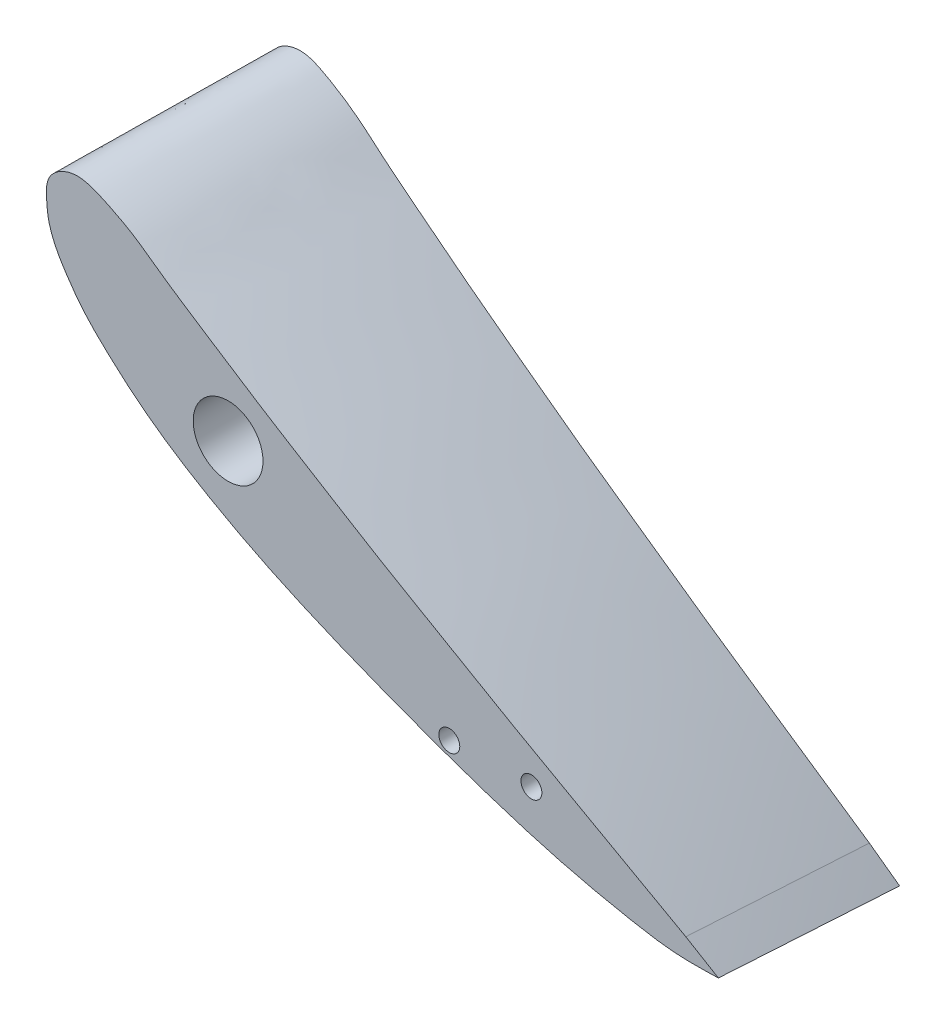
ISO-10303-21;
HEADER;
FILE_DESCRIPTION(('STEP AP214'),'2;1');
FILE_NAME('part.step','',(''),(''),'','','');
FILE_SCHEMA(('AUTOMOTIVE_DESIGN { 1 0 10303 214 1 1 1 1 }'));
ENDSEC;
DATA;
#1=APPLICATION_CONTEXT('core data for automotive mechanical design processes');
#2=APPLICATION_PROTOCOL_DEFINITION('international standard','automotive_design',2000,#1);
#3=PRODUCT_CONTEXT('',#1,'mechanical');
#4=PRODUCT('Part','Part','',(#3));
#5=PRODUCT_RELATED_PRODUCT_CATEGORY('part','',(#4));
#6=PRODUCT_DEFINITION_FORMATION('','',#4);
#7=PRODUCT_DEFINITION_CONTEXT('part definition',#1,'design');
#8=PRODUCT_DEFINITION('design','',#6,#7);
#9=PRODUCT_DEFINITION_SHAPE('','',#8);
#10=(LENGTH_UNIT() NAMED_UNIT(*) SI_UNIT(.MILLI.,.METRE.));
#11=(NAMED_UNIT(*) PLANE_ANGLE_UNIT() SI_UNIT($,.RADIAN.));
#12=(NAMED_UNIT(*) SI_UNIT($,.STERADIAN.) SOLID_ANGLE_UNIT());
#13=UNCERTAINTY_MEASURE_WITH_UNIT(LENGTH_MEASURE(1.E-05),#10,'distance_accuracy_value','');
#14=(GEOMETRIC_REPRESENTATION_CONTEXT(3) GLOBAL_UNCERTAINTY_ASSIGNED_CONTEXT((#13)) GLOBAL_UNIT_ASSIGNED_CONTEXT((#10,
#11,#12)) REPRESENTATION_CONTEXT('',''));
#15=CARTESIAN_POINT('',(0.,0.,0.));
#16=DIRECTION('',(0.,0.,1.));
#17=DIRECTION('',(1.,0.,0.));
#18=AXIS2_PLACEMENT_3D('',#15,#16,#17);
#19=CARTESIAN_POINT('',(-24.0107675203707,16.9470014810061,-30.));
#20=DIRECTION('',(0.,0.,1.));
#21=DIRECTION('',(1.,0.,0.));
#22=AXIS2_PLACEMENT_3D('',#19,#20,#21);
#23=PLANE('',#22);
#24=CARTESIAN_POINT('',(31.6897428885911,-21.3075758774188,-30.));
#25=DIRECTION('',(0.,0.,1.));
#26=DIRECTION('',(1.,0.,0.));
#27=AXIS2_PLACEMENT_3D('',#24,#25,#26);
#28=CIRCLE('',#27,1.5);
#29=CARTESIAN_POINT('',(33.1897428885911,-21.3075758774188,-30.));
#30=VERTEX_POINT('',#29);
#31=EDGE_CURVE('E78',#30,#30,#28,.T.);
#32=ORIENTED_EDGE('',*,*,#31,.T.);
#33=EDGE_LOOP('',(#32));
#34=FACE_BOUND('',#33,.T.);
#35=CARTESIAN_POINT('',(0.,0.,-30.));
#36=DIRECTION('',(0.,0.,1.));
#37=DIRECTION('',(1.,0.,0.));
#38=AXIS2_PLACEMENT_3D('',#35,#36,#37);
#39=CIRCLE('',#38,5.);
#40=CARTESIAN_POINT('',(5.,0.,-30.));
#41=VERTEX_POINT('',#40);
#42=EDGE_CURVE('E71',#41,#41,#39,.T.);
#43=ORIENTED_EDGE('',*,*,#42,.T.);
#44=EDGE_LOOP('',(#43));
#45=FACE_BOUND('',#44,.T.);
#46=CARTESIAN_POINT('',(61.868833704388,-33.9492414141092,-30.));
#47=CARTESIAN_POINT('',(60.3927587182459,-32.9440677163768,-30.));
#48=CARTESIAN_POINT('',(55.9645337598205,-29.9285466231819,-30.));
#49=CARTESIAN_POINT('',(48.5939604320893,-24.8885639730853,-30.));
#50=CARTESIAN_POINT('',(39.7032187980151,-18.909001329102,-30.));
#51=CARTESIAN_POINT('',(30.9859119367577,-12.6817951941061,-30.));
#52=CARTESIAN_POINT('',(22.1730692745511,-6.59216260993577,-30.));
#53=CARTESIAN_POINT('',(13.5748323520827,-0.20396020534763,-30.));
#54=CARTESIAN_POINT('',(4.96581440972182,6.17308342153412,-30.));
#55=CARTESIAN_POINT('',(-2.03814223882868,11.7123894473554,-30.));
#56=CARTESIAN_POINT('',(-7.66494261812838,16.1250910446004,-30.));
#57=CARTESIAN_POINT('',(-10.9699019673765,19.1425921626249,-30.));
#58=CARTESIAN_POINT('',(-13.9206091189597,21.1889817668647,-30.));
#59=CARTESIAN_POINT('',(-16.2499218012269,22.5483879741082,-30.));
#60=CARTESIAN_POINT('',(-18.4407669591291,23.6109319545201,-30.));
#61=CARTESIAN_POINT('',(-21.0777187386111,23.6309301454486,-30.));
#62=CARTESIAN_POINT('',(-23.949248518026,22.1002942010044,-30.));
#63=CARTESIAN_POINT('',(-24.0725960660568,18.9014761214317,-30.));
#64=CARTESIAN_POINT('',(-24.0323082844689,16.0189415953341,-30.));
#65=CARTESIAN_POINT('',(-23.1506414800944,13.2627619311373,-30.));
#66=CARTESIAN_POINT('',(-21.7131566786579,10.5177601845058,-30.));
#67=CARTESIAN_POINT('',(-19.7651413955332,7.21727566943067,-30.));
#68=CARTESIAN_POINT('',(-16.7361428266371,3.68962430279513,-30.));
#69=CARTESIAN_POINT('',(-11.7660731989215,-1.5753567339448,-30.));
#70=CARTESIAN_POINT('',(-4.71831937673372,-7.17743790472392,-30.));
#71=CARTESIAN_POINT('',(4.26812146292364,-13.0797147806775,-30.));
#72=CARTESIAN_POINT('',(13.7343403321874,-18.2710248457323,-30.));
#73=CARTESIAN_POINT('',(23.4461019393518,-23.1213429498701,-30.));
#74=CARTESIAN_POINT('',(33.3782170591954,-27.7074721518719,-30.));
#75=CARTESIAN_POINT('',(43.6386303791182,-31.9204476795489,-30.));
#76=CARTESIAN_POINT('',(52.5768147709611,-34.7475874407676,-30.));
#77=CARTESIAN_POINT('',(60.1173229513558,-36.7200147983291,-30.));
#78=CARTESIAN_POINT('',(64.1286457620026,-36.9672869008036,-30.));
#79=CARTESIAN_POINT('',(66.2024410141075,-37.0951229629449,-30.));
#80=B_SPLINE_CURVE_WITH_KNOTS('',3,(#46,#47,#48,#49,#50,#51,#52,#53,#54,#55,#56,#57,#58,#59,#60,
#61,#62,#63,#64,#65,#66,#67,#68,#69,#70,#71,#72,#73,#74,#75,#76,#77,#78,#79),.UNSPECIFIED.,.F.,
.F.,(4,1,1,1,1,1,1,1,1,1,1,1,1,1,1,1,1,1,1,1,1,1,1,1,1,1,1,1,1,1,1,4),(0.,0.024539223239315,
0.0736176697179449,0.122696116196575,0.171758102468826,0.220820088741077,0.269879113320182,
0.318936693489756,0.368025361597795,0.392583028094628,0.417173001250673,0.429440472758663,
0.441764658743505,0.454461371263475,0.461994015532278,0.477712656864197,0.492780517083889,
0.502278122505289,0.517831839222446,0.531656069899839,0.544957030128068,0.57036121074101,
0.595284183630096,0.644429948946362,0.693535769444944,0.742943262592495,0.792666042354747,
0.842690657547491,0.893260265870848,0.94491578158227,0.971522264346957,1.),.UNSPECIFIED.);
#81=CARTESIAN_POINT('',(61.868833704388,-33.9492414141092,-30.));
#82=VERTEX_POINT('',#81);
#83=CARTESIAN_POINT('',(66.2024410141075,-37.0951229629449,-30.));
#84=VERTEX_POINT('',#83);
#85=EDGE_CURVE('E37',#82,#84,#80,.T.);
#86=ORIENTED_EDGE('',*,*,#85,.F.);
#87=DIRECTION('',(-0.809253887239892,0.587459058988049,0.));
#88=VECTOR('',#87,1.);
#89=CARTESIAN_POINT('',(66.2024410141075,-37.0951229629449,-30.));
#90=LINE('',#89,#88);
#91=EDGE_CURVE('E62',#84,#82,#90,.T.);
#92=ORIENTED_EDGE('',*,*,#91,.F.);
#93=EDGE_LOOP('',(#86,#92));
#94=FACE_BOUND('',#93,.T.);
#95=ADVANCED_FACE('F34',(#34,#45,#94),#23,.F.);
#96=CARTESIAN_POINT('',(-25.789086185669,14.9556146012437,0.));
#97=DIRECTION('',(0.,0.,1.));
#98=DIRECTION('',(1.,0.,0.));
#99=AXIS2_PLACEMENT_3D('',#96,#97,#98);
#100=PLANE('',#99);
#101=CARTESIAN_POINT('',(43.4541338442568,-21.1786975584337,0.));
#102=DIRECTION('',(0.,0.,1.));
#103=DIRECTION('',(1.,0.,0.));
#104=AXIS2_PLACEMENT_3D('',#101,#102,#103);
#105=CIRCLE('',#104,1.5);
#106=CARTESIAN_POINT('',(44.9541338442568,-21.1786975584337,0.));
#107=VERTEX_POINT('',#106);
#108=EDGE_CURVE('E150',#107,#107,#105,.T.);
#109=ORIENTED_EDGE('',*,*,#108,.F.);
#110=EDGE_LOOP('',(#109));
#111=FACE_BOUND('',#110,.T.);
#112=CARTESIAN_POINT('',(31.6897428885911,-21.3075758774188,0.));
#113=DIRECTION('',(0.,0.,1.));
#114=DIRECTION('',(1.,0.,0.));
#115=AXIS2_PLACEMENT_3D('',#112,#113,#114);
#116=CIRCLE('',#115,1.5);
#117=CARTESIAN_POINT('',(33.1897428885911,-21.3075758774188,0.));
#118=VERTEX_POINT('',#117);
#119=EDGE_CURVE('E81',#118,#118,#116,.T.);
#120=ORIENTED_EDGE('',*,*,#119,.F.);
#121=EDGE_LOOP('',(#120));
#122=FACE_BOUND('',#121,.T.);
#123=CARTESIAN_POINT('',(0.,0.,0.));
#124=DIRECTION('',(0.,0.,1.));
#125=DIRECTION('',(1.,0.,0.));
#126=AXIS2_PLACEMENT_3D('',#123,#124,#125);
#127=CIRCLE('',#126,5.);
#128=CARTESIAN_POINT('',(5.,0.,0.));
#129=VERTEX_POINT('',#128);
#130=EDGE_CURVE('E73',#129,#129,#127,.T.);
#131=ORIENTED_EDGE('',*,*,#130,.F.);
#132=EDGE_LOOP('',(#131));
#133=FACE_BOUND('',#132,.T.);
#134=CARTESIAN_POINT('',(65.5739573309162,-28.7173000329715,0.));
#135=CARTESIAN_POINT('',(63.9918671686072,-27.8349277479633,0.));
#136=CARTESIAN_POINT('',(59.2455966816811,-25.1878108929409,0.));
#137=CARTESIAN_POINT('',(51.3437752224579,-20.760804430331,0.));
#138=CARTESIAN_POINT('',(41.8212332738992,-15.5216786302253,0.));
#139=CARTESIAN_POINT('',(32.451573198761,-10.0166902311277,0.));
#140=CARTESIAN_POINT('',(22.9978035086664,-4.65932332355163,0.));
#141=CARTESIAN_POINT('',(13.7339171348711,1.01907601010571,0.));
#142=CARTESIAN_POINT('',(4.46014511403473,6.68522792284203,0.));
#143=CARTESIAN_POINT('',(-3.1163251148217,11.649820016503,0.));
#144=CARTESIAN_POINT('',(-9.19968968461705,15.6004231292486,0.));
#145=CARTESIAN_POINT('',(-12.8112327854822,18.350917021048,0.));
#146=CARTESIAN_POINT('',(-15.9772082035379,20.1522075245231,0.));
#147=CARTESIAN_POINT('',(-18.4533482644197,21.3154772066417,0.));
#148=CARTESIAN_POINT('',(-20.762793568469,22.1913051711168,0.));
#149=CARTESIAN_POINT('',(-23.4288771253178,21.973521547609,0.));
#150=CARTESIAN_POINT('',(-26.1920224533883,20.1678634281628,0.));
#151=CARTESIAN_POINT('',(-26.0279498835935,16.9247634703913,0.));
#152=CARTESIAN_POINT('',(-25.7270913097616,14.0159930804658,0.));
#153=CARTESIAN_POINT('',(-24.5875381711682,11.310822760205,0.));
#154=CARTESIAN_POINT('',(-22.8874158808214,8.66710964588079,0.));
#155=CARTESIAN_POINT('',(-20.621339251034,5.50823343889777,0.));
#156=CARTESIAN_POINT('',(-17.2425748661609,2.21739668139687,0.));
#157=CARTESIAN_POINT('',(-11.7458272294005,-2.65358908625349,0.));
#158=CARTESIAN_POINT('',(-4.11944039800331,-7.67765410393565,0.));
#159=CARTESIAN_POINT('',(5.49281733100073,-12.8300562141478,0.));
#160=CARTESIAN_POINT('',(15.5256591856785,-17.2208229925941,0.));
#161=CARTESIAN_POINT('',(25.7758132919287,-21.2449034680802,0.));
#162=CARTESIAN_POINT('',(36.2247609840777,-24.982169981968,0.));
#163=CARTESIAN_POINT('',(46.9717313450525,-28.3127863745016,0.));
#164=CARTESIAN_POINT('',(56.25769656678,-30.3625387372331,0.));
#165=CARTESIAN_POINT('',(64.054362221775,-31.6748637365026,0.));
#166=CARTESIAN_POINT('',(68.1295713384236,-31.562670126222,0.));
#167=CARTESIAN_POINT('',(70.2363948767859,-31.5046676698508,0.));
#168=B_SPLINE_CURVE_WITH_KNOTS('',3,(#134,#135,#136,#137,#138,#139,#140,#141,#142,#143,#144,
#145,#146,#147,#148,#149,#150,#151,#152,#153,#154,#155,#156,#157,#158,#159,#160,#161,#162,#163,
#164,#165,#166,#167),.UNSPECIFIED.,.F.,.F.,(4,1,1,1,1,1,1,1,1,1,1,1,1,1,1,1,1,1,1,1,1,1,1,1,1,1,
1,1,1,1,1,4),(0.,0.024539223239315,0.0736176697179449,0.122696116196575,0.171758102468826,
0.220820088741077,0.269879113320182,0.318936693489756,0.368025361597795,0.392583028094628,
0.417173001250673,0.429440472758663,0.441764658743505,0.454461371263475,0.461994015532278,
0.477712656864197,0.492780517083889,0.502278122505289,0.517831839222446,0.531656069899839,
0.544957030128068,0.57036121074101,0.595284183630096,0.644429948946362,0.693535769444944,
0.742943262592495,0.792666042354747,0.842690657547491,0.893260265870848,0.94491578158227,
0.971522264346957,1.),.UNSPECIFIED.);
#169=CARTESIAN_POINT('',(65.5739573309162,-28.7173000329715,0.));
#170=VERTEX_POINT('',#169);
#171=CARTESIAN_POINT('',(70.2363948767859,-31.5046676698508,0.));
#172=VERTEX_POINT('',#171);
#173=EDGE_CURVE('E45',#170,#172,#168,.T.);
#174=ORIENTED_EDGE('',*,*,#173,.T.);
#175=DIRECTION('',(-0.858311708800499,0.513128649108552,0.));
#176=VECTOR('',#175,1.);
#177=CARTESIAN_POINT('',(65.5739573309162,-28.7173000329715,0.));
#178=LINE('',#177,#176);
#179=EDGE_CURVE('E11',#172,#170,#178,.T.);
#180=ORIENTED_EDGE('',*,*,#179,.T.);
#181=EDGE_LOOP('',(#174,#180));
#182=FACE_BOUND('',#181,.T.);
#183=ADVANCED_FACE('F91',(#111,#122,#133,#182),#100,.T.);
#184=CARTESIAN_POINT('',(70.2363948767859,-31.5046676698508,0.));
#185=CARTESIAN_POINT('',(66.2024410141075,-37.0951229629449,-30.));
#186=CARTESIAN_POINT('',(68.1295713384236,-31.562670126222,0.));
#187=CARTESIAN_POINT('',(64.1286457620026,-36.9672869008036,-30.));
#188=CARTESIAN_POINT('',(64.054362221775,-31.6748637365026,0.));
#189=CARTESIAN_POINT('',(60.1173229513558,-36.7200147983291,-30.));
#190=CARTESIAN_POINT('',(56.25769656678,-30.3625387372331,0.));
#191=CARTESIAN_POINT('',(52.5768147709611,-34.7475874407676,-30.));
#192=CARTESIAN_POINT('',(46.9717313450525,-28.3127863745016,0.));
#193=CARTESIAN_POINT('',(43.6386303791182,-31.9204476795489,-30.));
#194=CARTESIAN_POINT('',(36.2247609840777,-24.982169981968,0.));
#195=CARTESIAN_POINT('',(33.3782170591954,-27.7074721518719,-30.));
#196=CARTESIAN_POINT('',(25.7758132919287,-21.2449034680802,0.));
#197=CARTESIAN_POINT('',(23.4461019393518,-23.1213429498701,-30.));
#198=CARTESIAN_POINT('',(15.5256591856785,-17.2208229925941,0.));
#199=CARTESIAN_POINT('',(13.7343403321874,-18.2710248457323,-30.));
#200=CARTESIAN_POINT('',(5.49281733100073,-12.8300562141478,0.));
#201=CARTESIAN_POINT('',(4.26812146292364,-13.0797147806775,-30.));
#202=CARTESIAN_POINT('',(-4.11944039800331,-7.67765410393565,0.));
#203=CARTESIAN_POINT('',(-4.71831937673372,-7.17743790472392,-30.));
#204=CARTESIAN_POINT('',(-11.7458272294005,-2.65358908625349,0.));
#205=CARTESIAN_POINT('',(-11.7660731989215,-1.5753567339448,-30.));
#206=CARTESIAN_POINT('',(-17.2425748661609,2.21739668139687,0.));
#207=CARTESIAN_POINT('',(-16.7361428266371,3.68962430279513,-30.));
#208=CARTESIAN_POINT('',(-20.621339251034,5.50823343889777,0.));
#209=CARTESIAN_POINT('',(-19.7651413955332,7.21727566943067,-30.));
#210=CARTESIAN_POINT('',(-22.8874158808214,8.66710964588079,0.));
#211=CARTESIAN_POINT('',(-21.7131566786579,10.5177601845058,-30.));
#212=CARTESIAN_POINT('',(-24.5875381711682,11.310822760205,0.));
#213=CARTESIAN_POINT('',(-23.1506414800944,13.2627619311373,-30.));
#214=CARTESIAN_POINT('',(-25.7270913097616,14.0159930804658,0.));
#215=CARTESIAN_POINT('',(-24.0323082844689,16.0189415953341,-30.));
#216=CARTESIAN_POINT('',(-26.0279498835935,16.9247634703913,0.));
#217=CARTESIAN_POINT('',(-24.0725960660568,18.9014761214317,-30.));
#218=CARTESIAN_POINT('',(-26.1920224533883,20.1678634281628,0.));
#219=CARTESIAN_POINT('',(-23.949248518026,22.1002942010044,-30.));
#220=CARTESIAN_POINT('',(-23.4288771253178,21.973521547609,0.));
#221=CARTESIAN_POINT('',(-21.0777187386111,23.6309301454486,-30.));
#222=CARTESIAN_POINT('',(-20.762793568469,22.1913051711168,0.));
#223=CARTESIAN_POINT('',(-18.4407669591291,23.6109319545201,-30.));
#224=CARTESIAN_POINT('',(-18.4533482644197,21.3154772066417,0.));
#225=CARTESIAN_POINT('',(-16.2499218012269,22.5483879741082,-30.));
#226=CARTESIAN_POINT('',(-15.9772082035379,20.1522075245231,0.));
#227=CARTESIAN_POINT('',(-13.9206091189597,21.1889817668647,-30.));
#228=CARTESIAN_POINT('',(-12.8112327854822,18.350917021048,0.));
#229=CARTESIAN_POINT('',(-10.9699019673765,19.1425921626249,-30.));
#230=CARTESIAN_POINT('',(-9.19968968461705,15.6004231292486,0.));
#231=CARTESIAN_POINT('',(-7.66494261812838,16.1250910446004,-30.));
#232=CARTESIAN_POINT('',(-3.1163251148217,11.649820016503,0.));
#233=CARTESIAN_POINT('',(-2.03814223882868,11.7123894473554,-30.));
#234=CARTESIAN_POINT('',(4.46014511403473,6.68522792284203,0.));
#235=CARTESIAN_POINT('',(4.96581440972182,6.17308342153412,-30.));
#236=CARTESIAN_POINT('',(13.7339171348711,1.01907601010571,0.));
#237=CARTESIAN_POINT('',(13.5748323520827,-0.20396020534763,-30.));
#238=CARTESIAN_POINT('',(22.9978035086664,-4.65932332355163,0.));
#239=CARTESIAN_POINT('',(22.1730692745511,-6.59216260993577,-30.));
#240=CARTESIAN_POINT('',(32.451573198761,-10.0166902311277,0.));
#241=CARTESIAN_POINT('',(30.9859119367577,-12.6817951941061,-30.));
#242=CARTESIAN_POINT('',(41.8212332738992,-15.5216786302253,0.));
#243=CARTESIAN_POINT('',(39.7032187980151,-18.909001329102,-30.));
#244=CARTESIAN_POINT('',(51.3437752224579,-20.760804430331,0.));
#245=CARTESIAN_POINT('',(48.5939604320893,-24.8885639730853,-30.));
#246=CARTESIAN_POINT('',(59.2455966816811,-25.1878108929409,0.));
#247=CARTESIAN_POINT('',(55.9645337598205,-29.9285466231819,-30.));
#248=CARTESIAN_POINT('',(63.9918671686072,-27.8349277479633,0.));
#249=CARTESIAN_POINT('',(60.3927587182459,-32.9440677163768,-30.));
#250=CARTESIAN_POINT('',(65.5739573309162,-28.7173000329715,0.));
#251=CARTESIAN_POINT('',(61.868833704388,-33.9492414141092,-30.));
#252=B_SPLINE_SURFACE_WITH_KNOTS('',3,1,((#184,#185),(#186,#187),(#188,#189),(#190,#191),(#192,
#193),(#194,#195),(#196,#197),(#198,#199),(#200,#201),(#202,#203),(#204,#205),(#206,#207),(#208,
#209),(#210,#211),(#212,#213),(#214,#215),(#216,#217),(#218,#219),(#220,#221),(#222,#223),(#224,
#225),(#226,#227),(#228,#229),(#230,#231),(#232,#233),(#234,#235),(#236,#237),(#238,#239),(#240,
#241),(#242,#243),(#244,#245),(#246,#247),(#248,#249),(#250,#251)),.UNSPECIFIED.,.F.,.F.,.F.,(4,
1,1,1,1,1,1,1,1,1,1,1,1,1,1,1,1,1,1,1,1,1,1,1,1,1,1,1,1,1,1,4),(2,2),(0.,0.0284777356530428,
0.05508421841773,0.106739734129152,0.157309342452509,0.207333957645253,0.257056737407505,
0.306464230555056,0.355570051053638,0.404715816369904,0.42963878925899,0.455042969871932,
0.468343930100161,0.482168160777554,0.497721877494711,0.507219482916111,0.522287343135803,
0.538005984467722,0.545538628736525,0.558235341256495,0.570559527241337,0.582826998749327,
0.607416971905372,0.631974638402205,0.681063306510244,0.730120886679818,0.779179911258923,
0.828241897531174,0.877303883803425,0.926382330282055,0.975460776760685,1.),(0.,1.),.UNSPECIFIED.);
#253=DIRECTION('',(-0.120777087057476,-0.170547248449408,-0.977919491209909));
#254=VECTOR('',#253,1.);
#255=CARTESIAN_POINT('',(63.7213955176521,-31.3332707235403,-15.));
#256=LINE('',#255,#254);
#257=EDGE_CURVE('E65',#170,#82,#256,.T.);
#258=DIRECTION('',(0.131049498944176,0.181614958913621,0.974598397046334));
#259=VECTOR('',#258,1.);
#260=CARTESIAN_POINT('',(68.2194179454467,-34.2998953163979,-15.));
#261=LINE('',#260,#259);
#262=EDGE_CURVE('E54',#84,#172,#261,.T.);
#263=ORIENTED_EDGE('',*,*,#173,.F.);
#264=ORIENTED_EDGE('',*,*,#257,.T.);
#265=ORIENTED_EDGE('',*,*,#85,.T.);
#266=ORIENTED_EDGE('',*,*,#262,.T.);
#267=EDGE_LOOP('',(#263,#264,#265,#266));
#268=FACE_BOUND('',#267,.T.);
#269=ADVANCED_FACE('F66',(#268),#252,.T.);
#270=CARTESIAN_POINT('',(65.5739573309162,-28.7173000329715,0.));
#271=CARTESIAN_POINT('',(61.868833704388,-33.9492414141092,-30.));
#272=CARTESIAN_POINT('',(66.3510302552278,-29.1818613057847,0.));
#273=CARTESIAN_POINT('',(62.5911015893412,-34.4735550055817,-30.));
#274=CARTESIAN_POINT('',(67.1281031795395,-29.646422578598,0.));
#275=CARTESIAN_POINT('',(63.3133694742944,-34.9978685970543,-30.));
#276=CARTESIAN_POINT('',(68.6822490281627,-30.5755451242244,0.));
#277=CARTESIAN_POINT('',(64.7579052442009,-36.0464957799996,-30.));
#278=CARTESIAN_POINT('',(69.4593219524743,-31.0401063970376,0.));
#279=CARTESIAN_POINT('',(65.4801731291542,-36.5708093714722,-30.));
#280=CARTESIAN_POINT('',(70.2363948767859,-31.5046676698508,0.));
#281=CARTESIAN_POINT('',(66.2024410141075,-37.0951229629449,-30.));
#282=B_SPLINE_SURFACE_WITH_KNOTS('',3,1,((#270,#271),(#272,#273),(#274,#275),(#276,#277),(#278,
#279),(#280,#281)),.UNSPECIFIED.,.F.,.F.,.F.,(4,2,4),(2,2),(0.,0.5,1.),(0.,1.),.UNSPECIFIED.);
#283=ORIENTED_EDGE('',*,*,#179,.F.);
#284=ORIENTED_EDGE('',*,*,#262,.F.);
#285=ORIENTED_EDGE('',*,*,#91,.T.);
#286=ORIENTED_EDGE('',*,*,#257,.F.);
#287=EDGE_LOOP('',(#283,#284,#285,#286));
#288=FACE_BOUND('',#287,.T.);
#289=ADVANCED_FACE('F70',(#288),#282,.T.);
#290=CARTESIAN_POINT('',(0.,0.,-30.));
#291=DIRECTION('',(0.,0.,1.));
#292=DIRECTION('',(1.,0.,0.));
#293=AXIS2_PLACEMENT_3D('',#290,#291,#292);
#294=CYLINDRICAL_SURFACE('',#293,5.);
#295=ORIENTED_EDGE('',*,*,#42,.F.);
#296=EDGE_LOOP('',(#295));
#297=FACE_BOUND('',#296,.T.);
#298=ORIENTED_EDGE('',*,*,#130,.T.);
#299=EDGE_LOOP('',(#298));
#300=FACE_BOUND('',#299,.T.);
#301=ADVANCED_FACE('F104',(#297,#300),#294,.F.);
#302=CARTESIAN_POINT('',(31.6897428885911,-21.3075758774188,-30.));
#303=DIRECTION('',(0.,0.,1.));
#304=DIRECTION('',(1.,0.,0.));
#305=AXIS2_PLACEMENT_3D('',#302,#303,#304);
#306=CYLINDRICAL_SURFACE('',#305,1.5);
#307=ORIENTED_EDGE('',*,*,#31,.F.);
#308=EDGE_LOOP('',(#307));
#309=FACE_BOUND('',#308,.T.);
#310=ORIENTED_EDGE('',*,*,#119,.T.);
#311=EDGE_LOOP('',(#310));
#312=FACE_BOUND('',#311,.T.);
#313=ADVANCED_FACE('F124',(#309,#312),#306,.F.);
#314=CARTESIAN_POINT('',(43.4541338442568,-21.1786975584337,-13.));
#315=DIRECTION('',(0.,0.,1.));
#316=DIRECTION('',(1.,0.,0.));
#317=AXIS2_PLACEMENT_3D('',#314,#315,#316);
#318=CYLINDRICAL_SURFACE('',#317,1.5);
#319=CARTESIAN_POINT('',(43.4541338442568,-21.1786975584337,-13.));
#320=DIRECTION('',(0.,0.,1.));
#321=DIRECTION('',(1.,0.,0.));
#322=AXIS2_PLACEMENT_3D('',#319,#320,#321);
#323=CIRCLE('',#322,1.5);
#324=CARTESIAN_POINT('',(44.9541338442568,-21.1786975584337,-13.));
#325=VERTEX_POINT('',#324);
#326=EDGE_CURVE('E149',#325,#325,#323,.T.);
#327=ORIENTED_EDGE('',*,*,#326,.F.);
#328=EDGE_LOOP('',(#327));
#329=FACE_BOUND('',#328,.T.);
#330=ORIENTED_EDGE('',*,*,#108,.T.);
#331=EDGE_LOOP('',(#330));
#332=FACE_BOUND('',#331,.T.);
#333=ADVANCED_FACE('F129',(#329,#332),#318,.F.);
#334=CARTESIAN_POINT('',(43.4541338442568,-21.1786975584337,-13.));
#335=DIRECTION('',(0.,0.,1.));
#336=DIRECTION('',(1.,0.,0.));
#337=AXIS2_PLACEMENT_3D('',#334,#335,#336);
#338=PLANE('',#337);
#339=ORIENTED_EDGE('',*,*,#326,.T.);
#340=EDGE_LOOP('',(#339));
#341=FACE_BOUND('',#340,.T.);
#342=ADVANCED_FACE('F137',(#341),#338,.T.);
#343=CLOSED_SHELL('',(#95,#183,#269,#289,#301,#313,#333,#342));
#344=MANIFOLD_SOLID_BREP('B2',#343);
#345=ADVANCED_BREP_SHAPE_REPRESENTATION('',(#18,#344),#14);
#346=SHAPE_DEFINITION_REPRESENTATION(#9,#345);
ENDSEC;
END-ISO-10303-21;
